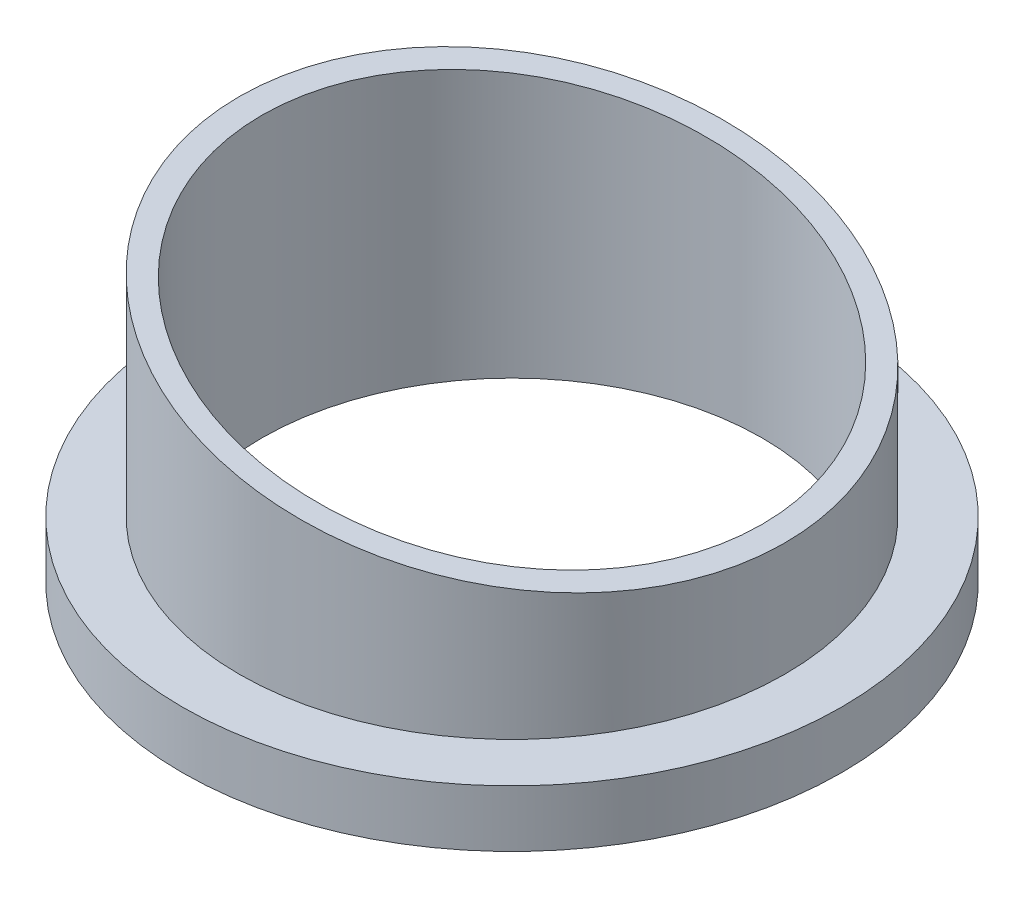
ISO-10303-21;
HEADER;
FILE_DESCRIPTION(('STEP AP214'),'2;1');
FILE_NAME('part.step','',(''),(''),'','','');
FILE_SCHEMA(('AUTOMOTIVE_DESIGN { 1 0 10303 214 1 1 1 1 }'));
ENDSEC;
DATA;
#1=APPLICATION_CONTEXT('core data for automotive mechanical design processes');
#2=APPLICATION_PROTOCOL_DEFINITION('international standard','automotive_design',2000,#1);
#3=PRODUCT_CONTEXT('',#1,'mechanical');
#4=PRODUCT('Part','Part','',(#3));
#5=PRODUCT_RELATED_PRODUCT_CATEGORY('part','',(#4));
#6=PRODUCT_DEFINITION_FORMATION('','',#4);
#7=PRODUCT_DEFINITION_CONTEXT('part definition',#1,'design');
#8=PRODUCT_DEFINITION('design','',#6,#7);
#9=PRODUCT_DEFINITION_SHAPE('','',#8);
#10=(LENGTH_UNIT() NAMED_UNIT(*) SI_UNIT(.MILLI.,.METRE.));
#11=(NAMED_UNIT(*) PLANE_ANGLE_UNIT() SI_UNIT($,.RADIAN.));
#12=(NAMED_UNIT(*) SI_UNIT($,.STERADIAN.) SOLID_ANGLE_UNIT());
#13=UNCERTAINTY_MEASURE_WITH_UNIT(LENGTH_MEASURE(1.E-05),#10,'distance_accuracy_value','');
#14=(GEOMETRIC_REPRESENTATION_CONTEXT(3) GLOBAL_UNCERTAINTY_ASSIGNED_CONTEXT((#13)) GLOBAL_UNIT_ASSIGNED_CONTEXT((#10,
#11,#12)) REPRESENTATION_CONTEXT('',''));
#15=CARTESIAN_POINT('',(0.,0.,0.));
#16=DIRECTION('',(0.,0.,1.));
#17=DIRECTION('',(1.,0.,0.));
#18=AXIS2_PLACEMENT_3D('',#15,#16,#17);
#19=CARTESIAN_POINT('',(0.,12.5,0.));
#20=DIRECTION('',(0.,-1.,0.));
#21=DIRECTION('',(0.,0.,-1.));
#22=AXIS2_PLACEMENT_3D('',#19,#20,#21);
#23=CYLINDRICAL_SURFACE('',#22,14.5);
#24=CARTESIAN_POINT('',(0.,0.,0.));
#25=DIRECTION('',(0.,1.,0.));
#26=DIRECTION('',(0.,0.,1.));
#27=AXIS2_PLACEMENT_3D('',#24,#25,#26);
#28=CIRCLE('',#27,14.5);
#29=CARTESIAN_POINT('',(0.,0.,14.5));
#30=VERTEX_POINT('',#29);
#31=EDGE_CURVE('E10',#30,#30,#28,.T.);
#32=ORIENTED_EDGE('',*,*,#31,.T.);
#33=EDGE_LOOP('',(#32));
#34=FACE_BOUND('',#33,.T.);
#35=CARTESIAN_POINT('',(0.,2.5,0.));
#36=DIRECTION('',(0.,1.,0.));
#37=DIRECTION('',(0.,0.,1.));
#38=AXIS2_PLACEMENT_3D('',#35,#36,#37);
#39=CIRCLE('',#38,14.5);
#40=CARTESIAN_POINT('',(0.,2.5,14.5));
#41=VERTEX_POINT('',#40);
#42=EDGE_CURVE('E37',#41,#41,#39,.T.);
#43=ORIENTED_EDGE('',*,*,#42,.F.);
#44=EDGE_LOOP('',(#43));
#45=FACE_BOUND('',#44,.T.);
#46=ADVANCED_FACE('F30',(#34,#45),#23,.T.);
#47=CARTESIAN_POINT('',(0.,0.,0.));
#48=DIRECTION('',(0.,1.,0.));
#49=DIRECTION('',(0.,0.,1.));
#50=AXIS2_PLACEMENT_3D('',#47,#48,#49);
#51=PLANE('',#50);
#52=CARTESIAN_POINT('',(0.,0.,0.));
#53=DIRECTION('',(0.,1.,0.));
#54=DIRECTION('',(0.,0.,1.));
#55=AXIS2_PLACEMENT_3D('',#52,#53,#54);
#56=CIRCLE('',#55,11.);
#57=CARTESIAN_POINT('',(0.,0.,11.));
#58=VERTEX_POINT('',#57);
#59=EDGE_CURVE('E46',#58,#58,#56,.T.);
#60=ORIENTED_EDGE('',*,*,#59,.T.);
#61=EDGE_LOOP('',(#60));
#62=FACE_BOUND('',#61,.T.);
#63=ORIENTED_EDGE('',*,*,#31,.F.);
#64=EDGE_LOOP('',(#63));
#65=FACE_BOUND('',#64,.T.);
#66=ADVANCED_FACE('F68',(#62,#65),#51,.F.);
#67=CARTESIAN_POINT('',(0.,2.5,0.));
#68=DIRECTION('',(0.,1.,0.));
#69=DIRECTION('',(0.,0.,1.));
#70=AXIS2_PLACEMENT_3D('',#67,#68,#69);
#71=PLANE('',#70);
#72=CARTESIAN_POINT('',(0.,2.5,0.));
#73=DIRECTION('',(0.,1.,0.));
#74=DIRECTION('',(0.,0.,1.));
#75=AXIS2_PLACEMENT_3D('',#72,#73,#74);
#76=CIRCLE('',#75,12.);
#77=CARTESIAN_POINT('',(0.,2.5,12.));
#78=VERTEX_POINT('',#77);
#79=EDGE_CURVE('E41',#78,#78,#76,.T.);
#80=ORIENTED_EDGE('',*,*,#79,.F.);
#81=EDGE_LOOP('',(#80));
#82=FACE_BOUND('',#81,.T.);
#83=ORIENTED_EDGE('',*,*,#42,.T.);
#84=EDGE_LOOP('',(#83));
#85=FACE_BOUND('',#84,.T.);
#86=ADVANCED_FACE('F72',(#82,#85),#71,.T.);
#87=CARTESIAN_POINT('',(0.,2.5,0.));
#88=DIRECTION('',(0.,1.,0.));
#89=DIRECTION('',(0.,0.,1.));
#90=AXIS2_PLACEMENT_3D('',#87,#88,#89);
#91=CYLINDRICAL_SURFACE('',#90,12.);
#92=CARTESIAN_POINT('',(0.,10.,0.));
#93=DIRECTION('',(-0.203954254112001,-0.978980419737605,0.));
#94=DIRECTION('',(-0.978980419737605,0.203954254112001,0.));
#95=AXIS2_PLACEMENT_3D('',#92,#93,#94);
#96=ELLIPSE('',#95,12.2576506721313,12.);
#97=CARTESIAN_POINT('',(-12.,12.5,0.));
#98=VERTEX_POINT('',#97);
#99=EDGE_CURVE('E49',#98,#98,#96,.F.);
#100=ORIENTED_EDGE('',*,*,#99,.F.);
#101=EDGE_LOOP('',(#100));
#102=FACE_BOUND('',#101,.T.);
#103=ORIENTED_EDGE('',*,*,#79,.T.);
#104=EDGE_LOOP('',(#103));
#105=FACE_BOUND('',#104,.T.);
#106=ADVANCED_FACE('F65',(#102,#105),#91,.T.);
#107=CARTESIAN_POINT('',(0.,0.,0.));
#108=DIRECTION('',(0.,1.,0.));
#109=DIRECTION('',(0.,0.,1.));
#110=AXIS2_PLACEMENT_3D('',#107,#108,#109);
#111=CYLINDRICAL_SURFACE('',#110,11.);
#112=CARTESIAN_POINT('',(0.,10.,0.));
#113=DIRECTION('',(-0.203954254112001,-0.978980419737605,0.));
#114=DIRECTION('',(-0.978980419737605,0.203954254112001,0.));
#115=AXIS2_PLACEMENT_3D('',#112,#113,#114);
#116=ELLIPSE('',#115,11.236179782787,11.);
#117=CARTESIAN_POINT('',(-11.,12.2916666666667,0.));
#118=VERTEX_POINT('',#117);
#119=EDGE_CURVE('E33',#118,#118,#116,.F.);
#120=ORIENTED_EDGE('',*,*,#119,.T.);
#121=EDGE_LOOP('',(#120));
#122=FACE_BOUND('',#121,.T.);
#123=ORIENTED_EDGE('',*,*,#59,.F.);
#124=EDGE_LOOP('',(#123));
#125=FACE_BOUND('',#124,.T.);
#126=ADVANCED_FACE('F56',(#122,#125),#111,.F.);
#127=CARTESIAN_POINT('',(12.,7.5,-14.5));
#128=DIRECTION('',(-0.203954254112001,-0.978980419737605,0.));
#129=DIRECTION('',(0.978980419737605,-0.203954254112001,0.));
#130=AXIS2_PLACEMENT_3D('',#127,#128,#129);
#131=PLANE('',#130);
#132=ORIENTED_EDGE('',*,*,#99,.T.);
#133=EDGE_LOOP('',(#132));
#134=FACE_BOUND('',#133,.T.);
#135=ORIENTED_EDGE('',*,*,#119,.F.);
#136=EDGE_LOOP('',(#135));
#137=FACE_BOUND('',#136,.T.);
#138=ADVANCED_FACE('F59',(#134,#137),#131,.F.);
#139=CLOSED_SHELL('',(#46,#66,#86,#106,#126,#138));
#140=MANIFOLD_SOLID_BREP('B2',#139);
#141=ADVANCED_BREP_SHAPE_REPRESENTATION('',(#18,#140),#14);
#142=SHAPE_DEFINITION_REPRESENTATION(#9,#141);
ENDSEC;
END-ISO-10303-21;
